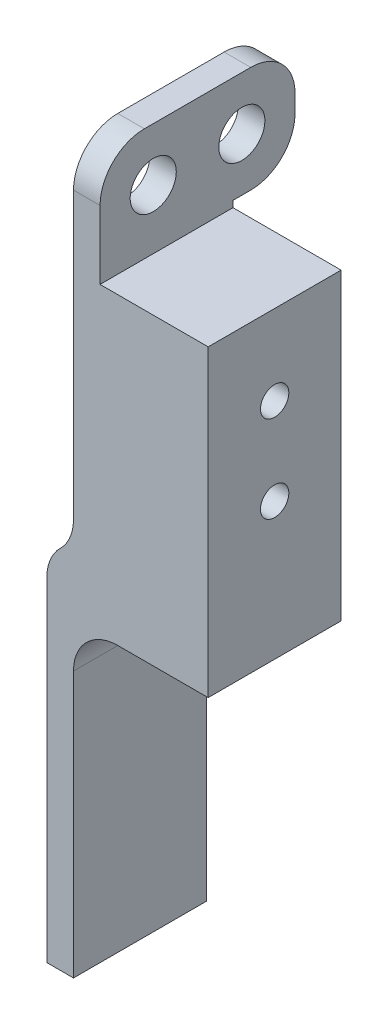
ISO-10303-21;
HEADER;
FILE_DESCRIPTION(('STEP AP214'),'2;1');
FILE_NAME('part.step','',(''),(''),'','','');
FILE_SCHEMA(('AUTOMOTIVE_DESIGN { 1 0 10303 214 1 1 1 1 }'));
ENDSEC;
DATA;
#1=APPLICATION_CONTEXT('core data for automotive mechanical design processes');
#2=APPLICATION_PROTOCOL_DEFINITION('international standard','automotive_design',2000,#1);
#3=PRODUCT_CONTEXT('',#1,'mechanical');
#4=PRODUCT('Part','Part','',(#3));
#5=PRODUCT_RELATED_PRODUCT_CATEGORY('part','',(#4));
#6=PRODUCT_DEFINITION_FORMATION('','',#4);
#7=PRODUCT_DEFINITION_CONTEXT('part definition',#1,'design');
#8=PRODUCT_DEFINITION('design','',#6,#7);
#9=PRODUCT_DEFINITION_SHAPE('','',#8);
#10=(LENGTH_UNIT() NAMED_UNIT(*) SI_UNIT(.MILLI.,.METRE.));
#11=(NAMED_UNIT(*) PLANE_ANGLE_UNIT() SI_UNIT($,.RADIAN.));
#12=(NAMED_UNIT(*) SI_UNIT($,.STERADIAN.) SOLID_ANGLE_UNIT());
#13=UNCERTAINTY_MEASURE_WITH_UNIT(LENGTH_MEASURE(1.E-05),#10,'distance_accuracy_value','');
#14=(GEOMETRIC_REPRESENTATION_CONTEXT(3) GLOBAL_UNCERTAINTY_ASSIGNED_CONTEXT((#13)) GLOBAL_UNIT_ASSIGNED_CONTEXT((#10,
#11,#12)) REPRESENTATION_CONTEXT('',''));
#15=CARTESIAN_POINT('',(0.,0.,0.));
#16=DIRECTION('',(0.,0.,1.));
#17=DIRECTION('',(1.,0.,0.));
#18=AXIS2_PLACEMENT_3D('',#15,#16,#17);
#19=CARTESIAN_POINT('',(3.,0.,0.));
#20=DIRECTION('',(-1.,0.,0.));
#21=DIRECTION('',(0.,0.,1.));
#22=AXIS2_PLACEMENT_3D('',#19,#20,#21);
#23=PLANE('',#22);
#24=CARTESIAN_POINT('',(3.,0.,0.));
#25=DIRECTION('',(1.,0.,0.));
#26=DIRECTION('',(0.,0.,-1.));
#27=AXIS2_PLACEMENT_3D('',#24,#25,#26);
#28=CIRCLE('',#27,2.6);
#29=CARTESIAN_POINT('',(3.,0.,-2.6));
#30=VERTEX_POINT('',#29);
#31=EDGE_CURVE('E214',#30,#30,#28,.T.);
#32=ORIENTED_EDGE('',*,*,#31,.F.);
#33=EDGE_LOOP('',(#32));
#34=FACE_BOUND('',#33,.T.);
#35=CARTESIAN_POINT('',(3.,0.,-10.));
#36=DIRECTION('',(1.,0.,0.));
#37=DIRECTION('',(0.,0.,-1.));
#38=AXIS2_PLACEMENT_3D('',#35,#36,#37);
#39=CIRCLE('',#38,2.6);
#40=CARTESIAN_POINT('',(3.,0.,-12.6));
#41=VERTEX_POINT('',#40);
#42=EDGE_CURVE('E220',#41,#41,#39,.T.);
#43=ORIENTED_EDGE('',*,*,#42,.F.);
#44=EDGE_LOOP('',(#43));
#45=FACE_BOUND('',#44,.T.);
#46=DIRECTION('',(0.,0.,1.));
#47=VECTOR('',#46,1.);
#48=CARTESIAN_POINT('',(3.,-6.71374419576464,-9.00000000000001));
#49=LINE('',#48,#47);
#50=CARTESIAN_POINT('',(3.,-6.71374419576464,-9.00000000000001));
#51=VERTEX_POINT('',#50);
#52=CARTESIAN_POINT('',(3.,-6.71374419576464,6.));
#53=VERTEX_POINT('',#52);
#54=EDGE_CURVE('E189',#51,#53,#49,.T.);
#55=ORIENTED_EDGE('',*,*,#54,.F.);
#56=DIRECTION('',(0.,1.,0.));
#57=VECTOR('',#56,1.);
#58=CARTESIAN_POINT('',(3.,-6.,-9.00000000000001));
#59=LINE('',#58,#57);
#60=CARTESIAN_POINT('',(3.,-6.,-9.00000000000001));
#61=VERTEX_POINT('',#60);
#62=EDGE_CURVE('E207',#51,#61,#59,.T.);
#63=ORIENTED_EDGE('',*,*,#62,.T.);
#64=DIRECTION('',(0.,0.,-1.));
#65=VECTOR('',#64,1.);
#66=CARTESIAN_POINT('',(3.,-6.,6.));
#67=LINE('',#66,#65);
#68=CARTESIAN_POINT('',(3.,-6.,-11.));
#69=VERTEX_POINT('',#68);
#70=EDGE_CURVE('E235',#61,#69,#67,.T.);
#71=ORIENTED_EDGE('',*,*,#70,.T.);
#72=CARTESIAN_POINT('',(3.,-1.,-11.));
#73=DIRECTION('',(-1.,0.,0.));
#74=DIRECTION('',(0.,0.,1.));
#75=AXIS2_PLACEMENT_3D('',#72,#73,#74);
#76=CIRCLE('',#75,5.);
#77=CARTESIAN_POINT('',(3.,-1.,-16.));
#78=VERTEX_POINT('',#77);
#79=EDGE_CURVE('E264',#69,#78,#76,.F.);
#80=ORIENTED_EDGE('',*,*,#79,.T.);
#81=DIRECTION('',(0.,1.,0.));
#82=VECTOR('',#81,1.);
#83=CARTESIAN_POINT('',(3.,-6.,-16.));
#84=LINE('',#83,#82);
#85=CARTESIAN_POINT('',(3.,1.,-16.));
#86=VERTEX_POINT('',#85);
#87=EDGE_CURVE('E226',#78,#86,#84,.T.);
#88=ORIENTED_EDGE('',*,*,#87,.T.);
#89=CARTESIAN_POINT('',(3.,1.,-11.));
#90=DIRECTION('',(-1.,0.,0.));
#91=DIRECTION('',(0.,0.,1.));
#92=AXIS2_PLACEMENT_3D('',#89,#90,#91);
#93=CIRCLE('',#92,5.);
#94=CARTESIAN_POINT('',(3.,6.,-11.));
#95=VERTEX_POINT('',#94);
#96=EDGE_CURVE('E262',#86,#95,#93,.F.);
#97=ORIENTED_EDGE('',*,*,#96,.T.);
#98=DIRECTION('',(0.,0.,1.));
#99=VECTOR('',#98,1.);
#100=CARTESIAN_POINT('',(3.,6.,6.));
#101=LINE('',#100,#99);
#102=CARTESIAN_POINT('',(3.,6.,0.999999999999996));
#103=VERTEX_POINT('',#102);
#104=EDGE_CURVE('E229',#95,#103,#101,.T.);
#105=ORIENTED_EDGE('',*,*,#104,.T.);
#106=CARTESIAN_POINT('',(3.,1.,0.999999999999996));
#107=DIRECTION('',(-1.,0.,0.));
#108=DIRECTION('',(0.,0.,1.));
#109=AXIS2_PLACEMENT_3D('',#106,#107,#108);
#110=CIRCLE('',#109,5.);
#111=CARTESIAN_POINT('',(3.,1.,6.));
#112=VERTEX_POINT('',#111);
#113=EDGE_CURVE('E266',#103,#112,#110,.F.);
#114=ORIENTED_EDGE('',*,*,#113,.T.);
#115=DIRECTION('',(0.,-1.,0.));
#116=VECTOR('',#115,1.);
#117=CARTESIAN_POINT('',(3.,-6.,6.));
#118=LINE('',#117,#116);
#119=EDGE_CURVE('E233',#112,#53,#118,.T.);
#120=ORIENTED_EDGE('',*,*,#119,.T.);
#121=EDGE_LOOP('',(#55,#63,#71,#80,#88,#97,#105,#114,#120));
#122=FACE_BOUND('',#121,.T.);
#123=ADVANCED_FACE('F32',(#34,#45,#122),#23,.F.);
#124=CARTESIAN_POINT('',(0.,0.,0.));
#125=DIRECTION('',(-1.,0.,0.));
#126=DIRECTION('',(0.,0.,1.));
#127=AXIS2_PLACEMENT_3D('',#124,#125,#126);
#128=PLANE('',#127);
#129=DIRECTION('',(0.,1.,0.));
#130=VECTOR('',#129,1.);
#131=CARTESIAN_POINT('',(0.,-6.,-9.00000000000001));
#132=LINE('',#131,#130);
#133=CARTESIAN_POINT('',(0.,-31.1860197833957,-9.00000000000001));
#134=VERTEX_POINT('',#133);
#135=CARTESIAN_POINT('',(0.,-6.,-9.00000000000001));
#136=VERTEX_POINT('',#135);
#137=EDGE_CURVE('E206',#134,#136,#132,.T.);
#138=ORIENTED_EDGE('',*,*,#137,.F.);
#139=DIRECTION('',(0.,0.,1.));
#140=VECTOR('',#139,1.);
#141=CARTESIAN_POINT('',(0.,-31.1860197833957,5.99999999999999));
#142=LINE('',#141,#140);
#143=CARTESIAN_POINT('',(0.,-31.1860197833957,6.));
#144=VERTEX_POINT('',#143);
#145=EDGE_CURVE('E279',#134,#144,#142,.T.);
#146=ORIENTED_EDGE('',*,*,#145,.T.);
#147=DIRECTION('',(0.,-1.,0.));
#148=VECTOR('',#147,1.);
#149=CARTESIAN_POINT('',(0.,-6.,6.));
#150=LINE('',#149,#148);
#151=CARTESIAN_POINT('',(0.,1.,6.));
#152=VERTEX_POINT('',#151);
#153=EDGE_CURVE('E244',#152,#144,#150,.T.);
#154=ORIENTED_EDGE('',*,*,#153,.F.);
#155=CARTESIAN_POINT('',(0.,1.,0.999999999999996));
#156=DIRECTION('',(-1.,0.,0.));
#157=DIRECTION('',(0.,0.,1.));
#158=AXIS2_PLACEMENT_3D('',#155,#156,#157);
#159=CIRCLE('',#158,5.);
#160=CARTESIAN_POINT('',(0.,6.,0.999999999999996));
#161=VERTEX_POINT('',#160);
#162=EDGE_CURVE('E255',#152,#161,#159,.T.);
#163=ORIENTED_EDGE('',*,*,#162,.T.);
#164=DIRECTION('',(0.,0.,1.));
#165=VECTOR('',#164,1.);
#166=CARTESIAN_POINT('',(0.,6.,6.));
#167=LINE('',#166,#165);
#168=CARTESIAN_POINT('',(0.,6.,-11.));
#169=VERTEX_POINT('',#168);
#170=EDGE_CURVE('E241',#169,#161,#167,.T.);
#171=ORIENTED_EDGE('',*,*,#170,.F.);
#172=CARTESIAN_POINT('',(0.,1.,-11.));
#173=DIRECTION('',(-1.,0.,0.));
#174=DIRECTION('',(0.,0.,1.));
#175=AXIS2_PLACEMENT_3D('',#172,#173,#174);
#176=CIRCLE('',#175,5.);
#177=CARTESIAN_POINT('',(0.,1.,-16.));
#178=VERTEX_POINT('',#177);
#179=EDGE_CURVE('E251',#169,#178,#176,.T.);
#180=ORIENTED_EDGE('',*,*,#179,.T.);
#181=DIRECTION('',(0.,1.,0.));
#182=VECTOR('',#181,1.);
#183=CARTESIAN_POINT('',(0.,-6.,-16.));
#184=LINE('',#183,#182);
#185=CARTESIAN_POINT('',(0.,-1.,-16.));
#186=VERTEX_POINT('',#185);
#187=EDGE_CURVE('E223',#186,#178,#184,.T.);
#188=ORIENTED_EDGE('',*,*,#187,.F.);
#189=CARTESIAN_POINT('',(0.,-1.,-11.));
#190=DIRECTION('',(-1.,0.,0.));
#191=DIRECTION('',(0.,0.,1.));
#192=AXIS2_PLACEMENT_3D('',#189,#190,#191);
#193=CIRCLE('',#192,5.);
#194=CARTESIAN_POINT('',(0.,-6.,-11.));
#195=VERTEX_POINT('',#194);
#196=EDGE_CURVE('E253',#186,#195,#193,.T.);
#197=ORIENTED_EDGE('',*,*,#196,.T.);
#198=DIRECTION('',(0.,0.,-1.));
#199=VECTOR('',#198,1.);
#200=CARTESIAN_POINT('',(0.,-6.,6.));
#201=LINE('',#200,#199);
#202=EDGE_CURVE('E230',#136,#195,#201,.T.);
#203=ORIENTED_EDGE('',*,*,#202,.F.);
#204=EDGE_LOOP('',(#138,#146,#154,#163,#171,#180,#188,#197,#203));
#205=FACE_BOUND('',#204,.T.);
#206=CARTESIAN_POINT('',(0.,-25.5468255350146,-1.50000000000001));
#207=DIRECTION('',(-1.,0.,0.));
#208=DIRECTION('',(0.,0.,1.));
#209=AXIS2_PLACEMENT_3D('',#206,#207,#208);
#210=CIRCLE('',#209,1.6);
#211=CARTESIAN_POINT('',(0.,-25.5468255350146,0.0999999999999951));
#212=VERTEX_POINT('',#211);
#213=EDGE_CURVE('E177',#212,#212,#210,.T.);
#214=ORIENTED_EDGE('',*,*,#213,.F.);
#215=EDGE_LOOP('',(#214));
#216=FACE_BOUND('',#215,.T.);
#217=CARTESIAN_POINT('',(0.,-15.7468255350146,-1.50000000000001));
#218=DIRECTION('',(-1.,0.,0.));
#219=DIRECTION('',(0.,0.,1.));
#220=AXIS2_PLACEMENT_3D('',#217,#218,#219);
#221=CIRCLE('',#220,1.6);
#222=CARTESIAN_POINT('',(0.,-15.7468255350146,0.0999999999999951));
#223=VERTEX_POINT('',#222);
#224=EDGE_CURVE('E174',#223,#223,#221,.T.);
#225=ORIENTED_EDGE('',*,*,#224,.F.);
#226=EDGE_LOOP('',(#225));
#227=FACE_BOUND('',#226,.T.);
#228=CARTESIAN_POINT('',(0.,0.,-10.));
#229=DIRECTION('',(1.,0.,0.));
#230=DIRECTION('',(0.,0.,-1.));
#231=AXIS2_PLACEMENT_3D('',#228,#229,#230);
#232=CIRCLE('',#231,2.6);
#233=CARTESIAN_POINT('',(0.,0.,-12.6));
#234=VERTEX_POINT('',#233);
#235=EDGE_CURVE('E217',#234,#234,#232,.T.);
#236=ORIENTED_EDGE('',*,*,#235,.T.);
#237=EDGE_LOOP('',(#236));
#238=FACE_BOUND('',#237,.T.);
#239=CARTESIAN_POINT('',(0.,0.,0.));
#240=DIRECTION('',(1.,0.,0.));
#241=DIRECTION('',(0.,0.,-1.));
#242=AXIS2_PLACEMENT_3D('',#239,#240,#241);
#243=CIRCLE('',#242,2.6);
#244=CARTESIAN_POINT('',(0.,0.,-2.6));
#245=VERTEX_POINT('',#244);
#246=EDGE_CURVE('E213',#245,#245,#243,.T.);
#247=ORIENTED_EDGE('',*,*,#246,.T.);
#248=EDGE_LOOP('',(#247));
#249=FACE_BOUND('',#248,.T.);
#250=ADVANCED_FACE('F323',(#205,#216,#227,#238,#249),#128,.T.);
#251=CARTESIAN_POINT('',(3.,-6.,-16.));
#252=DIRECTION('',(0.,0.,1.));
#253=DIRECTION('',(1.,0.,0.));
#254=AXIS2_PLACEMENT_3D('',#251,#252,#253);
#255=PLANE('',#254);
#256=ORIENTED_EDGE('',*,*,#87,.F.);
#257=DIRECTION('',(-1.,0.,0.));
#258=VECTOR('',#257,1.);
#259=CARTESIAN_POINT('',(3.,-1.,-16.));
#260=LINE('',#259,#258);
#261=EDGE_CURVE('E270',#78,#186,#260,.T.);
#262=ORIENTED_EDGE('',*,*,#261,.T.);
#263=ORIENTED_EDGE('',*,*,#187,.T.);
#264=DIRECTION('',(-1.,0.,0.));
#265=VECTOR('',#264,1.);
#266=CARTESIAN_POINT('',(3.,1.,-16.));
#267=LINE('',#266,#265);
#268=EDGE_CURVE('E268',#178,#86,#267,.F.);
#269=ORIENTED_EDGE('',*,*,#268,.T.);
#270=EDGE_LOOP('',(#256,#262,#263,#269));
#271=FACE_BOUND('',#270,.T.);
#272=ADVANCED_FACE('F344',(#271),#255,.F.);
#273=CARTESIAN_POINT('',(3.,6.,6.));
#274=DIRECTION('',(0.,-1.,0.));
#275=DIRECTION('',(0.,0.,-1.));
#276=AXIS2_PLACEMENT_3D('',#273,#274,#275);
#277=PLANE('',#276);
#278=ORIENTED_EDGE('',*,*,#170,.T.);
#279=DIRECTION('',(-1.,0.,0.));
#280=VECTOR('',#279,1.);
#281=CARTESIAN_POINT('',(3.,6.,0.999999999999996));
#282=LINE('',#281,#280);
#283=EDGE_CURVE('E260',#161,#103,#282,.F.);
#284=ORIENTED_EDGE('',*,*,#283,.T.);
#285=ORIENTED_EDGE('',*,*,#104,.F.);
#286=DIRECTION('',(-1.,0.,0.));
#287=VECTOR('',#286,1.);
#288=CARTESIAN_POINT('',(3.,6.,-11.));
#289=LINE('',#288,#287);
#290=EDGE_CURVE('E257',#95,#169,#289,.T.);
#291=ORIENTED_EDGE('',*,*,#290,.T.);
#292=EDGE_LOOP('',(#278,#284,#285,#291));
#293=FACE_BOUND('',#292,.T.);
#294=ADVANCED_FACE('F334',(#293),#277,.F.);
#295=CARTESIAN_POINT('',(3.,-6.,6.));
#296=DIRECTION('',(0.,0.,-1.));
#297=DIRECTION('',(-1.,0.,0.));
#298=AXIS2_PLACEMENT_3D('',#295,#296,#297);
#299=PLANE('',#298);
#300=CARTESIAN_POINT('',(-5.,-31.1860197833957,5.99999999999999));
#301=DIRECTION('',(0.,0.,-1.));
#302=DIRECTION('',(-1.,0.,0.));
#303=AXIS2_PLACEMENT_3D('',#300,#301,#302);
#304=CIRCLE('',#303,5.);
#305=CARTESIAN_POINT('',(-1.5,-34.7567339976671,5.99999999999999));
#306=VERTEX_POINT('',#305);
#307=EDGE_CURVE('E287',#144,#306,#304,.T.);
#308=ORIENTED_EDGE('',*,*,#307,.T.);
#309=CARTESIAN_POINT('',(2.,-38.3274482119385,5.99999999999999));
#310=DIRECTION('',(0.,0.,-1.));
#311=DIRECTION('',(-1.,0.,0.));
#312=AXIS2_PLACEMENT_3D('',#309,#310,#311);
#313=CIRCLE('',#312,5.);
#314=CARTESIAN_POINT('',(-3.,-38.3274482119385,6.));
#315=VERTEX_POINT('',#314);
#316=EDGE_CURVE('E295',#306,#315,#313,.F.);
#317=ORIENTED_EDGE('',*,*,#316,.T.);
#318=DIRECTION('',(0.,1.,0.));
#319=VECTOR('',#318,1.);
#320=CARTESIAN_POINT('',(-3.,-35.7685954783515,6.));
#321=LINE('',#320,#319);
#322=CARTESIAN_POINT('',(-3.,-76.,6.));
#323=VERTEX_POINT('',#322);
#324=EDGE_CURVE('E168',#323,#315,#321,.T.);
#325=ORIENTED_EDGE('',*,*,#324,.F.);
#326=DIRECTION('',(1.,0.,0.));
#327=VECTOR('',#326,1.);
#328=CARTESIAN_POINT('',(-3.,-76.,6.));
#329=LINE('',#328,#327);
#330=CARTESIAN_POINT('',(0.,-76.,6.));
#331=VERTEX_POINT('',#330);
#332=EDGE_CURVE('E166',#323,#331,#329,.T.);
#333=ORIENTED_EDGE('',*,*,#332,.T.);
#334=DIRECTION('',(0.,1.,0.));
#335=VECTOR('',#334,1.);
#336=CARTESIAN_POINT('',(0.,-35.7685954783515,6.));
#337=LINE('',#336,#335);
#338=CARTESIAN_POINT('',(0.,-46.,6.));
#339=VERTEX_POINT('',#338);
#340=EDGE_CURVE('E159',#331,#339,#337,.T.);
#341=ORIENTED_EDGE('',*,*,#340,.T.);
#342=CARTESIAN_POINT('',(5.,-46.,6.));
#343=DIRECTION('',(0.,0.,-1.));
#344=DIRECTION('',(-1.,0.,0.));
#345=AXIS2_PLACEMENT_3D('',#342,#343,#344);
#346=CIRCLE('',#345,5.);
#347=CARTESIAN_POINT('',(5.,-41.,6.));
#348=VERTEX_POINT('',#347);
#349=EDGE_CURVE('E40',#339,#348,#346,.T.);
#350=ORIENTED_EDGE('',*,*,#349,.T.);
#351=DIRECTION('',(-1.,0.,0.));
#352=VECTOR('',#351,1.);
#353=CARTESIAN_POINT('',(3.,-41.,6.));
#354=LINE('',#353,#352);
#355=CARTESIAN_POINT('',(15.2,-41.,6.));
#356=VERTEX_POINT('',#355);
#357=EDGE_CURVE('E275',#348,#356,#354,.F.);
#358=ORIENTED_EDGE('',*,*,#357,.T.);
#359=DIRECTION('',(0.,-1.,0.));
#360=VECTOR('',#359,1.);
#361=CARTESIAN_POINT('',(15.2,-6.71374419576464,6.));
#362=LINE('',#361,#360);
#363=CARTESIAN_POINT('',(15.2,-6.71374419576464,6.));
#364=VERTEX_POINT('',#363);
#365=EDGE_CURVE('E191',#364,#356,#362,.T.);
#366=ORIENTED_EDGE('',*,*,#365,.F.);
#367=DIRECTION('',(-1.,0.,0.));
#368=VECTOR('',#367,1.);
#369=CARTESIAN_POINT('',(15.2,-6.71374419576464,6.));
#370=LINE('',#369,#368);
#371=EDGE_CURVE('E197',#364,#53,#370,.T.);
#372=ORIENTED_EDGE('',*,*,#371,.T.);
#373=ORIENTED_EDGE('',*,*,#119,.F.);
#374=DIRECTION('',(-1.,0.,0.));
#375=VECTOR('',#374,1.);
#376=CARTESIAN_POINT('',(3.,1.,6.));
#377=LINE('',#376,#375);
#378=EDGE_CURVE('E238',#112,#152,#377,.T.);
#379=ORIENTED_EDGE('',*,*,#378,.T.);
#380=ORIENTED_EDGE('',*,*,#153,.T.);
#381=EDGE_LOOP('',(#308,#317,#325,#333,#341,#350,#358,#366,#372,#373,#379,#380));
#382=FACE_BOUND('',#381,.T.);
#383=ADVANCED_FACE('F306',(#382),#299,.F.);
#384=CARTESIAN_POINT('',(3.,-6.,6.));
#385=DIRECTION('',(0.,1.,0.));
#386=DIRECTION('',(0.,0.,1.));
#387=AXIS2_PLACEMENT_3D('',#384,#385,#386);
#388=PLANE('',#387);
#389=ORIENTED_EDGE('',*,*,#202,.T.);
#390=DIRECTION('',(-1.,0.,0.));
#391=VECTOR('',#390,1.);
#392=CARTESIAN_POINT('',(3.,-6.,-11.));
#393=LINE('',#392,#391);
#394=EDGE_CURVE('E273',#195,#69,#393,.F.);
#395=ORIENTED_EDGE('',*,*,#394,.T.);
#396=ORIENTED_EDGE('',*,*,#70,.F.);
#397=DIRECTION('',(-1.,0.,0.));
#398=VECTOR('',#397,1.);
#399=CARTESIAN_POINT('',(3.,-6.,-9.00000000000001));
#400=LINE('',#399,#398);
#401=EDGE_CURVE('E209',#61,#136,#400,.T.);
#402=ORIENTED_EDGE('',*,*,#401,.T.);
#403=EDGE_LOOP('',(#389,#395,#396,#402));
#404=FACE_BOUND('',#403,.T.);
#405=ADVANCED_FACE('F351',(#404),#388,.F.);
#406=CARTESIAN_POINT('',(3.,0.,-10.));
#407=DIRECTION('',(-1.,0.,0.));
#408=DIRECTION('',(0.,0.,1.));
#409=AXIS2_PLACEMENT_3D('',#406,#407,#408);
#410=CYLINDRICAL_SURFACE('',#409,2.6);
#411=ORIENTED_EDGE('',*,*,#42,.T.);
#412=EDGE_LOOP('',(#411));
#413=FACE_BOUND('',#412,.T.);
#414=ORIENTED_EDGE('',*,*,#235,.F.);
#415=EDGE_LOOP('',(#414));
#416=FACE_BOUND('',#415,.T.);
#417=ADVANCED_FACE('F379',(#413,#416),#410,.F.);
#418=CARTESIAN_POINT('',(3.,0.,0.));
#419=DIRECTION('',(-1.,0.,0.));
#420=DIRECTION('',(0.,0.,1.));
#421=AXIS2_PLACEMENT_3D('',#418,#419,#420);
#422=CYLINDRICAL_SURFACE('',#421,2.6);
#423=ORIENTED_EDGE('',*,*,#31,.T.);
#424=EDGE_LOOP('',(#423));
#425=FACE_BOUND('',#424,.T.);
#426=ORIENTED_EDGE('',*,*,#246,.F.);
#427=EDGE_LOOP('',(#426));
#428=FACE_BOUND('',#427,.T.);
#429=ADVANCED_FACE('F425',(#425,#428),#422,.F.);
#430=CARTESIAN_POINT('',(3.,-6.,-9.00000000000001));
#431=DIRECTION('',(0.,0.,1.));
#432=DIRECTION('',(0.,-1.,0.));
#433=AXIS2_PLACEMENT_3D('',#430,#431,#432);
#434=PLANE('',#433);
#435=DIRECTION('',(0.,-1.,0.));
#436=VECTOR('',#435,1.);
#437=CARTESIAN_POINT('',(-3.,-35.7685954783515,-9.00000000000001));
#438=LINE('',#437,#436);
#439=CARTESIAN_POINT('',(-3.,-38.3274482119385,-9.00000000000001));
#440=VERTEX_POINT('',#439);
#441=CARTESIAN_POINT('',(-3.,-76.,-9.00000000000001));
#442=VERTEX_POINT('',#441);
#443=EDGE_CURVE('E149',#440,#442,#438,.T.);
#444=ORIENTED_EDGE('',*,*,#443,.F.);
#445=CARTESIAN_POINT('',(2.,-38.3274482119385,-9.00000000000001));
#446=DIRECTION('',(0.,0.,1.));
#447=DIRECTION('',(0.,-1.,0.));
#448=AXIS2_PLACEMENT_3D('',#445,#446,#447);
#449=CIRCLE('',#448,5.);
#450=CARTESIAN_POINT('',(-1.5,-34.7567339976671,-9.00000000000001));
#451=VERTEX_POINT('',#450);
#452=EDGE_CURVE('E291',#440,#451,#449,.F.);
#453=ORIENTED_EDGE('',*,*,#452,.T.);
#454=CARTESIAN_POINT('',(-5.,-31.1860197833957,-9.00000000000001));
#455=DIRECTION('',(0.,0.,1.));
#456=DIRECTION('',(0.,-1.,0.));
#457=AXIS2_PLACEMENT_3D('',#454,#455,#456);
#458=CIRCLE('',#457,5.);
#459=EDGE_CURVE('E285',#451,#134,#458,.T.);
#460=ORIENTED_EDGE('',*,*,#459,.T.);
#461=ORIENTED_EDGE('',*,*,#137,.T.);
#462=ORIENTED_EDGE('',*,*,#401,.F.);
#463=ORIENTED_EDGE('',*,*,#62,.F.);
#464=DIRECTION('',(-1.,0.,0.));
#465=VECTOR('',#464,1.);
#466=CARTESIAN_POINT('',(15.2,-6.71374419576464,-9.00000000000001));
#467=LINE('',#466,#465);
#468=CARTESIAN_POINT('',(15.2,-6.71374419576464,-9.00000000000001));
#469=VERTEX_POINT('',#468);
#470=EDGE_CURVE('E203',#469,#51,#467,.T.);
#471=ORIENTED_EDGE('',*,*,#470,.F.);
#472=DIRECTION('',(0.,1.,0.));
#473=VECTOR('',#472,1.);
#474=CARTESIAN_POINT('',(15.2,-6.71374419576464,-9.00000000000001));
#475=LINE('',#474,#473);
#476=CARTESIAN_POINT('',(15.2,-41.,-9.00000000000001));
#477=VERTEX_POINT('',#476);
#478=EDGE_CURVE('E185',#477,#469,#475,.T.);
#479=ORIENTED_EDGE('',*,*,#478,.F.);
#480=DIRECTION('',(-1.,0.,0.));
#481=VECTOR('',#480,1.);
#482=CARTESIAN_POINT('',(3.,-41.,-9.00000000000001));
#483=LINE('',#482,#481);
#484=CARTESIAN_POINT('',(5.,-41.,-9.00000000000001));
#485=VERTEX_POINT('',#484);
#486=EDGE_CURVE('E277',#477,#485,#483,.T.);
#487=ORIENTED_EDGE('',*,*,#486,.T.);
#488=CARTESIAN_POINT('',(5.,-46.,-9.00000000000001));
#489=DIRECTION('',(0.,0.,1.));
#490=DIRECTION('',(0.,-1.,0.));
#491=AXIS2_PLACEMENT_3D('',#488,#489,#490);
#492=CIRCLE('',#491,5.);
#493=CARTESIAN_POINT('',(0.,-46.,-9.00000000000001));
#494=VERTEX_POINT('',#493);
#495=EDGE_CURVE('E11',#485,#494,#492,.T.);
#496=ORIENTED_EDGE('',*,*,#495,.T.);
#497=DIRECTION('',(0.,-1.,0.));
#498=VECTOR('',#497,1.);
#499=CARTESIAN_POINT('',(0.,-35.7685954783515,-9.00000000000001));
#500=LINE('',#499,#498);
#501=CARTESIAN_POINT('',(0.,-76.,-9.00000000000001));
#502=VERTEX_POINT('',#501);
#503=EDGE_CURVE('E172',#494,#502,#500,.T.);
#504=ORIENTED_EDGE('',*,*,#503,.T.);
#505=DIRECTION('',(1.,0.,0.));
#506=VECTOR('',#505,1.);
#507=CARTESIAN_POINT('',(-3.,-76.,-9.00000000000001));
#508=LINE('',#507,#506);
#509=EDGE_CURVE('E164',#442,#502,#508,.T.);
#510=ORIENTED_EDGE('',*,*,#509,.F.);
#511=EDGE_LOOP('',(#444,#453,#460,#461,#462,#463,#471,#479,#487,#496,#504,#510));
#512=FACE_BOUND('',#511,.T.);
#513=ADVANCED_FACE('F170',(#512),#434,.F.);
#514=CARTESIAN_POINT('',(3.,1.,0.999999999999996));
#515=DIRECTION('',(-1.,0.,0.));
#516=DIRECTION('',(0.,0.,1.));
#517=AXIS2_PLACEMENT_3D('',#514,#515,#516);
#518=CYLINDRICAL_SURFACE('',#517,5.);
#519=ORIENTED_EDGE('',*,*,#113,.F.);
#520=ORIENTED_EDGE('',*,*,#283,.F.);
#521=ORIENTED_EDGE('',*,*,#162,.F.);
#522=ORIENTED_EDGE('',*,*,#378,.F.);
#523=EDGE_LOOP('',(#519,#520,#521,#522));
#524=FACE_BOUND('',#523,.T.);
#525=ADVANCED_FACE('F330',(#524),#518,.T.);
#526=CARTESIAN_POINT('',(3.,-1.,-11.));
#527=DIRECTION('',(-1.,0.,0.));
#528=DIRECTION('',(0.,0.,1.));
#529=AXIS2_PLACEMENT_3D('',#526,#527,#528);
#530=CYLINDRICAL_SURFACE('',#529,5.);
#531=ORIENTED_EDGE('',*,*,#79,.F.);
#532=ORIENTED_EDGE('',*,*,#394,.F.);
#533=ORIENTED_EDGE('',*,*,#196,.F.);
#534=ORIENTED_EDGE('',*,*,#261,.F.);
#535=EDGE_LOOP('',(#531,#532,#533,#534));
#536=FACE_BOUND('',#535,.T.);
#537=ADVANCED_FACE('F348',(#536),#530,.T.);
#538=CARTESIAN_POINT('',(3.,1.,-11.));
#539=DIRECTION('',(-1.,0.,0.));
#540=DIRECTION('',(0.,0.,1.));
#541=AXIS2_PLACEMENT_3D('',#538,#539,#540);
#542=CYLINDRICAL_SURFACE('',#541,5.);
#543=ORIENTED_EDGE('',*,*,#96,.F.);
#544=ORIENTED_EDGE('',*,*,#268,.F.);
#545=ORIENTED_EDGE('',*,*,#179,.F.);
#546=ORIENTED_EDGE('',*,*,#290,.F.);
#547=EDGE_LOOP('',(#543,#544,#545,#546));
#548=FACE_BOUND('',#547,.T.);
#549=ADVANCED_FACE('F339',(#548),#542,.T.);
#550=CARTESIAN_POINT('',(15.2,-6.71374419576464,-9.00000000000001));
#551=DIRECTION('',(0.,-1.,0.));
#552=DIRECTION('',(0.,0.,-1.));
#553=AXIS2_PLACEMENT_3D('',#550,#551,#552);
#554=PLANE('',#553);
#555=ORIENTED_EDGE('',*,*,#54,.T.);
#556=ORIENTED_EDGE('',*,*,#371,.F.);
#557=DIRECTION('',(0.,0.,1.));
#558=VECTOR('',#557,1.);
#559=CARTESIAN_POINT('',(15.2,-6.71374419576464,-9.00000000000001));
#560=LINE('',#559,#558);
#561=EDGE_CURVE('E188',#469,#364,#560,.T.);
#562=ORIENTED_EDGE('',*,*,#561,.F.);
#563=ORIENTED_EDGE('',*,*,#470,.T.);
#564=EDGE_LOOP('',(#555,#556,#562,#563));
#565=FACE_BOUND('',#564,.T.);
#566=ADVANCED_FACE('F359',(#565),#554,.F.);
#567=CARTESIAN_POINT('',(15.2,-41.,-9.00000000000001));
#568=DIRECTION('',(0.,1.,0.));
#569=DIRECTION('',(0.,0.,1.));
#570=AXIS2_PLACEMENT_3D('',#567,#568,#569);
#571=PLANE('',#570);
#572=ORIENTED_EDGE('',*,*,#357,.F.);
#573=DIRECTION('',(0.,0.,1.));
#574=VECTOR('',#573,1.);
#575=CARTESIAN_POINT('',(5.,-41.,-9.00000000000001));
#576=LINE('',#575,#574);
#577=EDGE_CURVE('E47',#348,#485,#576,.F.);
#578=ORIENTED_EDGE('',*,*,#577,.T.);
#579=ORIENTED_EDGE('',*,*,#486,.F.);
#580=DIRECTION('',(0.,0.,-1.));
#581=VECTOR('',#580,1.);
#582=CARTESIAN_POINT('',(15.2,-41.,-9.00000000000001));
#583=LINE('',#582,#581);
#584=EDGE_CURVE('E194',#356,#477,#583,.T.);
#585=ORIENTED_EDGE('',*,*,#584,.F.);
#586=EDGE_LOOP('',(#572,#578,#579,#585));
#587=FACE_BOUND('',#586,.T.);
#588=ADVANCED_FACE('F418',(#587),#571,.F.);
#589=CARTESIAN_POINT('',(15.2,0.,0.));
#590=DIRECTION('',(-1.,0.,0.));
#591=DIRECTION('',(0.,0.,1.));
#592=AXIS2_PLACEMENT_3D('',#589,#590,#591);
#593=PLANE('',#592);
#594=CARTESIAN_POINT('',(15.2,-25.5468255350146,-1.50000000000001));
#595=DIRECTION('',(-1.,0.,0.));
#596=DIRECTION('',(0.,0.,1.));
#597=AXIS2_PLACEMENT_3D('',#594,#595,#596);
#598=CIRCLE('',#597,1.6);
#599=CARTESIAN_POINT('',(15.2,-25.5468255350146,0.0999999999999951));
#600=VERTEX_POINT('',#599);
#601=EDGE_CURVE('E200',#600,#600,#598,.T.);
#602=ORIENTED_EDGE('',*,*,#601,.T.);
#603=EDGE_LOOP('',(#602));
#604=FACE_BOUND('',#603,.T.);
#605=CARTESIAN_POINT('',(15.2,-15.7468255350146,-1.50000000000001));
#606=DIRECTION('',(-1.,0.,0.));
#607=DIRECTION('',(0.,0.,1.));
#608=AXIS2_PLACEMENT_3D('',#605,#606,#607);
#609=CIRCLE('',#608,1.6);
#610=CARTESIAN_POINT('',(15.2,-15.7468255350146,0.0999999999999951));
#611=VERTEX_POINT('',#610);
#612=EDGE_CURVE('E183',#611,#611,#609,.T.);
#613=ORIENTED_EDGE('',*,*,#612,.T.);
#614=EDGE_LOOP('',(#613));
#615=FACE_BOUND('',#614,.T.);
#616=ORIENTED_EDGE('',*,*,#478,.T.);
#617=ORIENTED_EDGE('',*,*,#561,.T.);
#618=ORIENTED_EDGE('',*,*,#365,.T.);
#619=ORIENTED_EDGE('',*,*,#584,.T.);
#620=EDGE_LOOP('',(#616,#617,#618,#619));
#621=FACE_BOUND('',#620,.T.);
#622=ADVANCED_FACE('F363',(#604,#615,#621),#593,.F.);
#623=CARTESIAN_POINT('',(40.,-15.7468255350146,-1.50000000000001));
#624=DIRECTION('',(-1.,0.,0.));
#625=DIRECTION('',(0.,0.,1.));
#626=AXIS2_PLACEMENT_3D('',#623,#624,#625);
#627=CYLINDRICAL_SURFACE('',#626,1.6);
#628=ORIENTED_EDGE('',*,*,#224,.T.);
#629=EDGE_LOOP('',(#628));
#630=FACE_BOUND('',#629,.T.);
#631=ORIENTED_EDGE('',*,*,#612,.F.);
#632=EDGE_LOOP('',(#631));
#633=FACE_BOUND('',#632,.T.);
#634=ADVANCED_FACE('F411',(#630,#633),#627,.F.);
#635=CARTESIAN_POINT('',(40.,-25.5468255350146,-1.50000000000001));
#636=DIRECTION('',(-1.,0.,0.));
#637=DIRECTION('',(0.,0.,1.));
#638=AXIS2_PLACEMENT_3D('',#635,#636,#637);
#639=CYLINDRICAL_SURFACE('',#638,1.6);
#640=ORIENTED_EDGE('',*,*,#213,.T.);
#641=EDGE_LOOP('',(#640));
#642=FACE_BOUND('',#641,.T.);
#643=ORIENTED_EDGE('',*,*,#601,.F.);
#644=EDGE_LOOP('',(#643));
#645=FACE_BOUND('',#644,.T.);
#646=ADVANCED_FACE('F407',(#642,#645),#639,.F.);
#647=CARTESIAN_POINT('',(0.,0.,0.));
#648=DIRECTION('',(-1.,0.,0.));
#649=DIRECTION('',(0.,0.,1.));
#650=AXIS2_PLACEMENT_3D('',#647,#648,#649);
#651=PLANE('',#650);
#652=ORIENTED_EDGE('',*,*,#503,.F.);
#653=DIRECTION('',(0.,0.,1.));
#654=VECTOR('',#653,1.);
#655=CARTESIAN_POINT('',(0.,-46.,6.));
#656=LINE('',#655,#654);
#657=EDGE_CURVE('E297',#494,#339,#656,.T.);
#658=ORIENTED_EDGE('',*,*,#657,.T.);
#659=ORIENTED_EDGE('',*,*,#340,.F.);
#660=DIRECTION('',(0.,0.,1.));
#661=VECTOR('',#660,1.);
#662=CARTESIAN_POINT('',(0.,-76.,-9.00000000000001));
#663=LINE('',#662,#661);
#664=EDGE_CURVE('E307',#502,#331,#663,.T.);
#665=ORIENTED_EDGE('',*,*,#664,.F.);
#666=EDGE_LOOP('',(#652,#658,#659,#665));
#667=FACE_BOUND('',#666,.T.);
#668=ADVANCED_FACE('F303',(#667),#651,.F.);
#669=CARTESIAN_POINT('',(-3.,-76.,-9.00000000000001));
#670=DIRECTION('',(0.,1.,0.));
#671=DIRECTION('',(0.,0.,1.));
#672=AXIS2_PLACEMENT_3D('',#669,#670,#671);
#673=PLANE('',#672);
#674=ORIENTED_EDGE('',*,*,#664,.T.);
#675=ORIENTED_EDGE('',*,*,#332,.F.);
#676=DIRECTION('',(0.,0.,1.));
#677=VECTOR('',#676,1.);
#678=CARTESIAN_POINT('',(-3.,-76.,-9.00000000000001));
#679=LINE('',#678,#677);
#680=EDGE_CURVE('E153',#442,#323,#679,.T.);
#681=ORIENTED_EDGE('',*,*,#680,.F.);
#682=ORIENTED_EDGE('',*,*,#509,.T.);
#683=EDGE_LOOP('',(#674,#675,#681,#682));
#684=FACE_BOUND('',#683,.T.);
#685=ADVANCED_FACE('F163',(#684),#673,.F.);
#686=CARTESIAN_POINT('',(-3.,0.,0.));
#687=DIRECTION('',(-1.,0.,0.));
#688=DIRECTION('',(0.,0.,1.));
#689=AXIS2_PLACEMENT_3D('',#686,#687,#688);
#690=PLANE('',#689);
#691=ORIENTED_EDGE('',*,*,#324,.T.);
#692=DIRECTION('',(0.,0.,1.));
#693=VECTOR('',#692,1.);
#694=CARTESIAN_POINT('',(-3.,-38.3274482119385,-9.00000000000001));
#695=LINE('',#694,#693);
#696=EDGE_CURVE('E156',#315,#440,#695,.F.);
#697=ORIENTED_EDGE('',*,*,#696,.T.);
#698=ORIENTED_EDGE('',*,*,#443,.T.);
#699=ORIENTED_EDGE('',*,*,#680,.T.);
#700=EDGE_LOOP('',(#691,#697,#698,#699));
#701=FACE_BOUND('',#700,.T.);
#702=ADVANCED_FACE('F152',(#701),#690,.T.);
#703=CARTESIAN_POINT('',(-5.,-31.1860197833957,-9.00000000000001));
#704=DIRECTION('',(0.,0.,-1.));
#705=DIRECTION('',(-1.,0.,0.));
#706=AXIS2_PLACEMENT_3D('',#703,#704,#705);
#707=CYLINDRICAL_SURFACE('',#706,5.);
#708=ORIENTED_EDGE('',*,*,#459,.F.);
#709=DIRECTION('',(0.,0.,-1.));
#710=VECTOR('',#709,1.);
#711=CARTESIAN_POINT('',(-1.5,-34.7567339976671,-9.00000000000001));
#712=LINE('',#711,#710);
#713=EDGE_CURVE('E293',#451,#306,#712,.F.);
#714=ORIENTED_EDGE('',*,*,#713,.T.);
#715=ORIENTED_EDGE('',*,*,#307,.F.);
#716=ORIENTED_EDGE('',*,*,#145,.F.);
#717=EDGE_LOOP('',(#708,#714,#715,#716));
#718=FACE_BOUND('',#717,.T.);
#719=ADVANCED_FACE('F319',(#718),#707,.F.);
#720=CARTESIAN_POINT('',(2.,-38.3274482119385,-9.00000000000001));
#721=DIRECTION('',(0.,0.,-1.));
#722=DIRECTION('',(-1.,0.,0.));
#723=AXIS2_PLACEMENT_3D('',#720,#721,#722);
#724=CYLINDRICAL_SURFACE('',#723,5.);
#725=ORIENTED_EDGE('',*,*,#316,.F.);
#726=ORIENTED_EDGE('',*,*,#713,.F.);
#727=ORIENTED_EDGE('',*,*,#452,.F.);
#728=ORIENTED_EDGE('',*,*,#696,.F.);
#729=EDGE_LOOP('',(#725,#726,#727,#728));
#730=FACE_BOUND('',#729,.T.);
#731=ADVANCED_FACE('F313',(#730),#724,.T.);
#732=CARTESIAN_POINT('',(5.,-46.,0.));
#733=DIRECTION('',(0.,0.,-1.));
#734=DIRECTION('',(-1.,0.,0.));
#735=AXIS2_PLACEMENT_3D('',#732,#733,#734);
#736=CYLINDRICAL_SURFACE('',#735,5.);
#737=ORIENTED_EDGE('',*,*,#495,.F.);
#738=ORIENTED_EDGE('',*,*,#577,.F.);
#739=ORIENTED_EDGE('',*,*,#349,.F.);
#740=ORIENTED_EDGE('',*,*,#657,.F.);
#741=EDGE_LOOP('',(#737,#738,#739,#740));
#742=FACE_BOUND('',#741,.T.);
#743=ADVANCED_FACE('F34',(#742),#736,.F.);
#744=CLOSED_SHELL('',(#123,#250,#272,#294,#383,#405,#417,#429,#513,#525,#537,#549,#566,#588,
#622,#634,#646,#668,#685,#702,#719,#731,#743));
#745=MANIFOLD_SOLID_BREP('B2',#744);
#746=ADVANCED_BREP_SHAPE_REPRESENTATION('',(#18,#745),#14);
#747=SHAPE_DEFINITION_REPRESENTATION(#9,#746);
ENDSEC;
END-ISO-10303-21;
